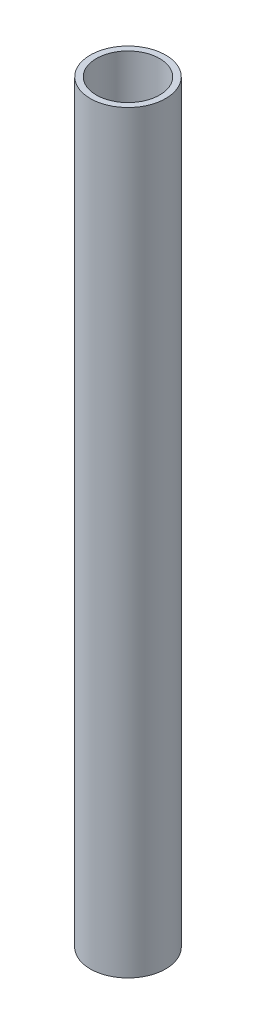
ISO-10303-21;
HEADER;
FILE_DESCRIPTION(('STEP AP214'),'2;1');
FILE_NAME('part.step','',(''),(''),'','','');
FILE_SCHEMA(('AUTOMOTIVE_DESIGN { 1 0 10303 214 1 1 1 1 }'));
ENDSEC;
DATA;
#1=APPLICATION_CONTEXT('core data for automotive mechanical design processes');
#2=APPLICATION_PROTOCOL_DEFINITION('international standard','automotive_design',2000,#1);
#3=PRODUCT_CONTEXT('',#1,'mechanical');
#4=PRODUCT('Part','Part','',(#3));
#5=PRODUCT_RELATED_PRODUCT_CATEGORY('part','',(#4));
#6=PRODUCT_DEFINITION_FORMATION('','',#4);
#7=PRODUCT_DEFINITION_CONTEXT('part definition',#1,'design');
#8=PRODUCT_DEFINITION('design','',#6,#7);
#9=PRODUCT_DEFINITION_SHAPE('','',#8);
#10=(LENGTH_UNIT() NAMED_UNIT(*) SI_UNIT(.MILLI.,.METRE.));
#11=(NAMED_UNIT(*) PLANE_ANGLE_UNIT() SI_UNIT($,.RADIAN.));
#12=(NAMED_UNIT(*) SI_UNIT($,.STERADIAN.) SOLID_ANGLE_UNIT());
#13=UNCERTAINTY_MEASURE_WITH_UNIT(LENGTH_MEASURE(1.E-05),#10,'distance_accuracy_value','');
#14=(GEOMETRIC_REPRESENTATION_CONTEXT(3) GLOBAL_UNCERTAINTY_ASSIGNED_CONTEXT((#13)) GLOBAL_UNIT_ASSIGNED_CONTEXT((#10,
#11,#12)) REPRESENTATION_CONTEXT('',''));
#15=CARTESIAN_POINT('',(0.,0.,0.));
#16=DIRECTION('',(0.,0.,1.));
#17=DIRECTION('',(1.,0.,0.));
#18=AXIS2_PLACEMENT_3D('',#15,#16,#17);
#19=CARTESIAN_POINT('',(0.,250.,0.));
#20=DIRECTION('',(0.,1.,0.));
#21=DIRECTION('',(0.,0.,1.));
#22=AXIS2_PLACEMENT_3D('',#19,#20,#21);
#23=PLANE('',#22);
#24=CARTESIAN_POINT('',(0.,250.,0.));
#25=DIRECTION('',(0.,1.,0.));
#26=DIRECTION('',(0.,0.,1.));
#27=AXIS2_PLACEMENT_3D('',#24,#25,#26);
#28=CIRCLE('',#27,12.5);
#29=CARTESIAN_POINT('',(0.,250.,12.5));
#30=VERTEX_POINT('',#29);
#31=EDGE_CURVE('E10',#30,#30,#28,.T.);
#32=ORIENTED_EDGE('',*,*,#31,.T.);
#33=EDGE_LOOP('',(#32));
#34=FACE_BOUND('',#33,.T.);
#35=CARTESIAN_POINT('',(0.,250.,0.));
#36=DIRECTION('',(0.,1.,0.));
#37=DIRECTION('',(0.,0.,1.));
#38=AXIS2_PLACEMENT_3D('',#35,#36,#37);
#39=CIRCLE('',#38,10.5);
#40=CARTESIAN_POINT('',(0.,250.,10.5));
#41=VERTEX_POINT('',#40);
#42=EDGE_CURVE('E42',#41,#41,#39,.T.);
#43=ORIENTED_EDGE('',*,*,#42,.F.);
#44=EDGE_LOOP('',(#43));
#45=FACE_BOUND('',#44,.T.);
#46=ADVANCED_FACE('F31',(#34,#45),#23,.T.);
#47=CARTESIAN_POINT('',(0.,0.,0.));
#48=DIRECTION('',(0.,1.,0.));
#49=DIRECTION('',(0.,0.,1.));
#50=AXIS2_PLACEMENT_3D('',#47,#48,#49);
#51=PLANE('',#50);
#52=CARTESIAN_POINT('',(0.,0.,0.));
#53=DIRECTION('',(0.,1.,0.));
#54=DIRECTION('',(0.,0.,1.));
#55=AXIS2_PLACEMENT_3D('',#52,#53,#54);
#56=CIRCLE('',#55,12.5);
#57=CARTESIAN_POINT('',(0.,0.,12.5));
#58=VERTEX_POINT('',#57);
#59=EDGE_CURVE('E35',#58,#58,#56,.T.);
#60=ORIENTED_EDGE('',*,*,#59,.F.);
#61=EDGE_LOOP('',(#60));
#62=FACE_BOUND('',#61,.T.);
#63=CARTESIAN_POINT('',(0.,0.,0.));
#64=DIRECTION('',(0.,1.,0.));
#65=DIRECTION('',(0.,0.,1.));
#66=AXIS2_PLACEMENT_3D('',#63,#64,#65);
#67=CIRCLE('',#66,10.5);
#68=CARTESIAN_POINT('',(0.,0.,10.5));
#69=VERTEX_POINT('',#68);
#70=EDGE_CURVE('E44',#69,#69,#67,.T.);
#71=ORIENTED_EDGE('',*,*,#70,.T.);
#72=EDGE_LOOP('',(#71));
#73=FACE_BOUND('',#72,.T.);
#74=ADVANCED_FACE('F54',(#62,#73),#51,.F.);
#75=CARTESIAN_POINT('',(0.,250.,0.));
#76=DIRECTION('',(0.,-1.,0.));
#77=DIRECTION('',(0.,0.,-1.));
#78=AXIS2_PLACEMENT_3D('',#75,#76,#77);
#79=CYLINDRICAL_SURFACE('',#78,12.5);
#80=ORIENTED_EDGE('',*,*,#31,.F.);
#81=EDGE_LOOP('',(#80));
#82=FACE_BOUND('',#81,.T.);
#83=ORIENTED_EDGE('',*,*,#59,.T.);
#84=EDGE_LOOP('',(#83));
#85=FACE_BOUND('',#84,.T.);
#86=ADVANCED_FACE('F33',(#82,#85),#79,.T.);
#87=CARTESIAN_POINT('',(0.,250.,0.));
#88=DIRECTION('',(0.,-1.,0.));
#89=DIRECTION('',(0.,0.,-1.));
#90=AXIS2_PLACEMENT_3D('',#87,#88,#89);
#91=CYLINDRICAL_SURFACE('',#90,10.5);
#92=ORIENTED_EDGE('',*,*,#42,.T.);
#93=EDGE_LOOP('',(#92));
#94=FACE_BOUND('',#93,.T.);
#95=ORIENTED_EDGE('',*,*,#70,.F.);
#96=EDGE_LOOP('',(#95));
#97=FACE_BOUND('',#96,.T.);
#98=ADVANCED_FACE('F50',(#94,#97),#91,.F.);
#99=CLOSED_SHELL('',(#46,#74,#86,#98));
#100=MANIFOLD_SOLID_BREP('B2',#99);
#101=ADVANCED_BREP_SHAPE_REPRESENTATION('',(#18,#100),#14);
#102=SHAPE_DEFINITION_REPRESENTATION(#9,#101);
ENDSEC;
END-ISO-10303-21;
